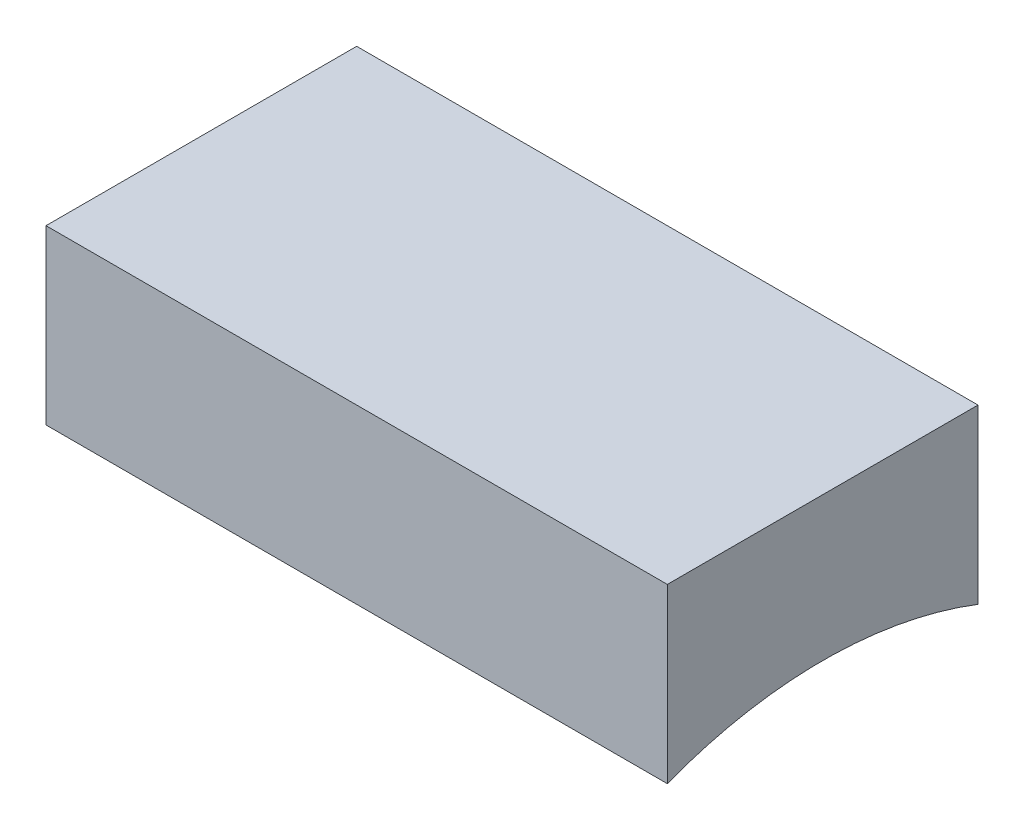
ISO-10303-21;
HEADER;
FILE_DESCRIPTION(('STEP AP214'),'2;1');
FILE_NAME('part.step','',(''),(''),'','','');
FILE_SCHEMA(('AUTOMOTIVE_DESIGN { 1 0 10303 214 1 1 1 1 }'));
ENDSEC;
DATA;
#1=APPLICATION_CONTEXT('core data for automotive mechanical design processes');
#2=APPLICATION_PROTOCOL_DEFINITION('international standard','automotive_design',2000,#1);
#3=PRODUCT_CONTEXT('',#1,'mechanical');
#4=PRODUCT('Part','Part','',(#3));
#5=PRODUCT_RELATED_PRODUCT_CATEGORY('part','',(#4));
#6=PRODUCT_DEFINITION_FORMATION('','',#4);
#7=PRODUCT_DEFINITION_CONTEXT('part definition',#1,'design');
#8=PRODUCT_DEFINITION('design','',#6,#7);
#9=PRODUCT_DEFINITION_SHAPE('','',#8);
#10=(LENGTH_UNIT() NAMED_UNIT(*) SI_UNIT(.MILLI.,.METRE.));
#11=(NAMED_UNIT(*) PLANE_ANGLE_UNIT() SI_UNIT($,.RADIAN.));
#12=(NAMED_UNIT(*) SI_UNIT($,.STERADIAN.) SOLID_ANGLE_UNIT());
#13=UNCERTAINTY_MEASURE_WITH_UNIT(LENGTH_MEASURE(1.E-05),#10,'distance_accuracy_value','');
#14=(GEOMETRIC_REPRESENTATION_CONTEXT(3) GLOBAL_UNCERTAINTY_ASSIGNED_CONTEXT((#13)) GLOBAL_UNIT_ASSIGNED_CONTEXT((#10,
#11,#12)) REPRESENTATION_CONTEXT('',''));
#15=CARTESIAN_POINT('',(0.,0.,0.));
#16=DIRECTION('',(0.,0.,1.));
#17=DIRECTION('',(1.,0.,0.));
#18=AXIS2_PLACEMENT_3D('',#15,#16,#17);
#19=CARTESIAN_POINT('',(-9.,5.,4.5));
#20=DIRECTION('',(1.,0.,0.));
#21=DIRECTION('',(0.,0.,-1.));
#22=AXIS2_PLACEMENT_3D('',#19,#20,#21);
#23=PLANE('',#22);
#24=DIRECTION('',(0.,-1.,0.));
#25=VECTOR('',#24,1.);
#26=CARTESIAN_POINT('',(-9.,3.6,2.5));
#27=LINE('',#26,#25);
#28=CARTESIAN_POINT('',(-9.,3.6,2.5));
#29=VERTEX_POINT('',#28);
#30=CARTESIAN_POINT('',(-9.,0.58554492422529,2.5));
#31=VERTEX_POINT('',#30);
#32=EDGE_CURVE('E189',#29,#31,#27,.T.);
#33=ORIENTED_EDGE('',*,*,#32,.T.);
#34=CARTESIAN_POINT('',(-9.,-11.6619037896906,0.));
#35=DIRECTION('',(-1.,0.,0.));
#36=DIRECTION('',(0.,0.,-1.));
#37=AXIS2_PLACEMENT_3D('',#34,#35,#36);
#38=CIRCLE('',#37,12.5);
#39=CARTESIAN_POINT('',(-9.,0.,4.5));
#40=VERTEX_POINT('',#39);
#41=EDGE_CURVE('E183',#40,#31,#38,.T.);
#42=ORIENTED_EDGE('',*,*,#41,.F.);
#43=DIRECTION('',(0.,-1.,0.));
#44=VECTOR('',#43,1.);
#45=CARTESIAN_POINT('',(-9.,5.,4.5));
#46=LINE('',#45,#44);
#47=CARTESIAN_POINT('',(-9.,5.,4.5));
#48=VERTEX_POINT('',#47);
#49=EDGE_CURVE('E104',#48,#40,#46,.T.);
#50=ORIENTED_EDGE('',*,*,#49,.F.);
#51=DIRECTION('',(0.,0.,1.));
#52=VECTOR('',#51,1.);
#53=CARTESIAN_POINT('',(-9.,5.,4.5));
#54=LINE('',#53,#52);
#55=CARTESIAN_POINT('',(-9.,5.,-4.5));
#56=VERTEX_POINT('',#55);
#57=EDGE_CURVE('E90',#56,#48,#54,.T.);
#58=ORIENTED_EDGE('',*,*,#57,.F.);
#59=DIRECTION('',(0.,-1.,0.));
#60=VECTOR('',#59,1.);
#61=CARTESIAN_POINT('',(-9.,5.,-4.5));
#62=LINE('',#61,#60);
#63=CARTESIAN_POINT('',(-9.,0.,-4.5));
#64=VERTEX_POINT('',#63);
#65=EDGE_CURVE('E99',#56,#64,#62,.T.);
#66=ORIENTED_EDGE('',*,*,#65,.T.);
#67=CARTESIAN_POINT('',(-9.,0.58554492422529,-2.5));
#68=VERTEX_POINT('',#67);
#69=EDGE_CURVE('E69',#68,#64,#38,.T.);
#70=ORIENTED_EDGE('',*,*,#69,.F.);
#71=DIRECTION('',(0.,-1.,0.));
#72=VECTOR('',#71,1.);
#73=CARTESIAN_POINT('',(-9.,3.6,-2.5));
#74=LINE('',#73,#72);
#75=CARTESIAN_POINT('',(-9.,3.6,-2.5));
#76=VERTEX_POINT('',#75);
#77=EDGE_CURVE('E48',#76,#68,#74,.T.);
#78=ORIENTED_EDGE('',*,*,#77,.F.);
#79=DIRECTION('',(0.,0.,1.));
#80=VECTOR('',#79,1.);
#81=CARTESIAN_POINT('',(-9.,3.6,-2.5));
#82=LINE('',#81,#80);
#83=EDGE_CURVE('E192',#76,#29,#82,.T.);
#84=ORIENTED_EDGE('',*,*,#83,.T.);
#85=EDGE_LOOP('',(#33,#42,#50,#58,#66,#70,#78,#84));
#86=FACE_BOUND('',#85,.T.);
#87=ADVANCED_FACE('F33',(#86),#23,.F.);
#88=CARTESIAN_POINT('',(9.,-11.6619037896906,0.));
#89=DIRECTION('',(-1.,0.,0.));
#90=DIRECTION('',(0.,0.,1.));
#91=AXIS2_PLACEMENT_3D('',#88,#89,#90);
#92=CYLINDRICAL_SURFACE('',#91,12.5);
#93=DIRECTION('',(-1.,0.,0.));
#94=VECTOR('',#93,1.);
#95=CARTESIAN_POINT('',(9.,0.58554492422529,2.5));
#96=LINE('',#95,#94);
#97=CARTESIAN_POINT('',(5.4,0.585544924225289,2.5));
#98=VERTEX_POINT('',#97);
#99=EDGE_CURVE('E11',#98,#31,#96,.T.);
#100=ORIENTED_EDGE('',*,*,#99,.F.);
#101=CARTESIAN_POINT('',(7.,0.805654110716359,0.9));
#102=CARTESIAN_POINT('',(6.99999985959667,0.802394784534018,0.945170151058865));
#103=CARTESIAN_POINT('',(6.99808603655796,0.798888537790257,0.990299871883101));
#104=CARTESIAN_POINT('',(6.99046112322638,0.791417444338855,1.08019413808191));
#105=CARTESIAN_POINT('',(6.98475045583305,0.787452648745855,1.1249587235639));
#106=CARTESIAN_POINT('',(6.96199866546493,0.774939153676864,1.25811218045941));
#107=CARTESIAN_POINT('',(6.93933747857087,0.765757761054272,1.34554730529643));
#108=CARTESIAN_POINT('',(6.87972886689265,0.746214905331677,1.51522524638052));
#109=CARTESIAN_POINT('',(6.84277884724533,0.735853228132318,1.59746711637093));
#110=CARTESIAN_POINT('',(6.75565385362339,0.714598897833527,1.75455556994002));
#111=CARTESIAN_POINT('',(6.70547869310982,0.703706237246408,1.82940204918717));
#112=CARTESIAN_POINT('',(6.59286526217099,0.682064741019977,1.97016739101782));
#113=CARTESIAN_POINT('',(6.53033928322142,0.671317558472885,2.03601634396535));
#114=CARTESIAN_POINT('',(6.3949523474623,0.650859469985577,2.15629122070428));
#115=CARTESIAN_POINT('',(6.32208972895832,0.641148731102351,2.21071530436487));
#116=CARTESIAN_POINT('',(6.16820940374735,0.623565019931765,2.30643188787346));
#117=CARTESIAN_POINT('',(6.08720875612795,0.615688313599212,2.3477511321171));
#118=CARTESIAN_POINT('',(5.91923171108847,0.602418887923724,2.41611482647644));
#119=CARTESIAN_POINT('',(5.83226012222345,0.597024196101398,2.44317061439278));
#120=CARTESIAN_POINT('',(5.68723716392164,0.590614407218349,2.47506690361218));
#121=CARTESIAN_POINT('',(5.63017494234265,0.588720008768401,2.48440845097697));
#122=CARTESIAN_POINT('',(5.51541769344701,0.586182850740518,2.4968752088144));
#123=CARTESIAN_POINT('',(5.45772350677789,0.585538593364218,2.50000785828572));
#124=CARTESIAN_POINT('',(5.4,0.585544924225291,2.5));
#125=B_SPLINE_CURVE_WITH_KNOTS('',3,(#101,#102,#103,#104,#105,#106,#107,#108,#109,#110,#111,
#112,#113,#114,#115,#116,#117,#118,#119,#120,#121,#122,#123,#124),.UNSPECIFIED.,.F.,.F.,(4,2,2,
2,2,2,2,2,2,2,2,4),(0.,0.13577739714354,0.271539673682466,0.542510298152163,0.81353015422453,
1.08455383320238,1.35757624471063,1.63064259651492,1.90314803336852,2.17543653201661,
2.34866967936891,2.52169514702194),.UNSPECIFIED.);
#126=CARTESIAN_POINT('',(7.,0.805654110716361,0.9));
#127=VERTEX_POINT('',#126);
#128=EDGE_CURVE('E41',#127,#98,#125,.T.);
#129=ORIENTED_EDGE('',*,*,#128,.F.);
#130=CARTESIAN_POINT('',(7.,-11.6619037896906,0.));
#131=DIRECTION('',(-1.,0.,0.));
#132=DIRECTION('',(0.,0.,1.));
#133=AXIS2_PLACEMENT_3D('',#130,#131,#132);
#134=CIRCLE('',#133,12.5);
#135=CARTESIAN_POINT('',(7.,0.805654110716359,-0.9));
#136=VERTEX_POINT('',#135);
#137=EDGE_CURVE('E131',#136,#127,#134,.F.);
#138=ORIENTED_EDGE('',*,*,#137,.F.);
#139=CARTESIAN_POINT('',(5.4,0.585544924225289,-2.5));
#140=CARTESIAN_POINT('',(5.44447478528946,0.585543455331564,-2.50000021689725));
#141=CARTESIAN_POINT('',(5.48892788903661,0.58592384545061,-2.49814443299796));
#142=CARTESIAN_POINT('',(5.57750830582583,0.587431443239871,-2.49074436307279));
#143=CARTESIAN_POINT('',(5.62163565461922,0.588558567686464,-2.48520048808476));
#144=CARTESIAN_POINT('',(5.75291094884181,0.593027695955822,-2.46310659922895));
#145=CARTESIAN_POINT('',(5.83916733116342,0.597457617127609,-2.44109405805094));
#146=CARTESIAN_POINT('',(6.00666605489368,0.608846533275155,-2.38317982723374));
#147=CARTESIAN_POINT('',(6.08790750041616,0.615805978613322,-2.3472756642242));
#148=CARTESIAN_POINT('',(6.24321474045728,0.631682992463709,-2.26264687616855));
#149=CARTESIAN_POINT('',(6.31727999251689,0.640600708838345,-2.21392128296454));
#150=CARTESIAN_POINT('',(6.45707089969971,0.659809581332696,-2.1043995153733));
#151=CARTESIAN_POINT('',(6.52269016959588,0.670115432216295,-2.04347022730598));
#152=CARTESIAN_POINT('',(6.64284955066309,0.691246904005578,-1.9115754408924));
#153=CARTESIAN_POINT('',(6.69738698402516,0.702072649758913,-1.84060752382735));
#154=CARTESIAN_POINT('',(6.79459931500864,0.723634220162914,-1.68948249299581));
#155=CARTESIAN_POINT('',(6.83709240546734,0.734366514753759,-1.60920794216262));
#156=CARTESIAN_POINT('',(6.90792121314798,0.754862422575954,-1.44254874295049));
#157=CARTESIAN_POINT('',(6.93626571151313,0.764626633612568,-1.35616792245351));
#158=CARTESIAN_POINT('',(6.97133736280917,0.77975695139372,-1.20778503668604));
#159=CARTESIAN_POINT('',(6.98206968951826,0.785535674197743,-1.14674178877397));
#160=CARTESIAN_POINT('',(6.99640223864335,0.796251711006129,-1.02382020525282));
#161=CARTESIAN_POINT('',(7.00001027927942,0.801189941923151,-0.961942860178801));
#162=CARTESIAN_POINT('',(7.,0.80565411071636,-0.9));
#163=B_SPLINE_CURVE_WITH_KNOTS('',3,(#139,#140,#141,#142,#143,#144,#145,#146,#147,#148,#149,
#150,#151,#152,#153,#154,#155,#156,#157,#158,#159,#160,#161,#162),.UNSPECIFIED.,.F.,.F.,(4,2,2,
2,2,2,2,2,2,2,2,4),(0.,0.133341175762014,0.266667493134828,0.532682892684959,0.798745677458551,
1.06482855864422,1.33398952523074,1.6032154545847,1.87631177853693,2.14923839734213,
2.33558838916868,2.52173376586004),.UNSPECIFIED.);
#164=CARTESIAN_POINT('',(5.4,0.585544924225292,-2.5));
#165=VERTEX_POINT('',#164);
#166=EDGE_CURVE('E123',#165,#136,#163,.T.);
#167=ORIENTED_EDGE('',*,*,#166,.F.);
#168=DIRECTION('',(-1.,0.,0.));
#169=VECTOR('',#168,1.);
#170=CARTESIAN_POINT('',(9.,0.585544924225292,-2.5));
#171=LINE('',#170,#169);
#172=EDGE_CURVE('E121',#68,#165,#171,.F.);
#173=ORIENTED_EDGE('',*,*,#172,.F.);
#174=ORIENTED_EDGE('',*,*,#69,.T.);
#175=DIRECTION('',(-1.,0.,0.));
#176=VECTOR('',#175,1.);
#177=CARTESIAN_POINT('',(-9.,0.,-4.5));
#178=LINE('',#177,#176);
#179=CARTESIAN_POINT('',(9.,0.,-4.5));
#180=VERTEX_POINT('',#179);
#181=EDGE_CURVE('E101',#180,#64,#178,.T.);
#182=ORIENTED_EDGE('',*,*,#181,.F.);
#183=CARTESIAN_POINT('',(9.,-11.6619037896906,0.));
#184=DIRECTION('',(-1.,0.,0.));
#185=DIRECTION('',(0.,0.,-1.));
#186=AXIS2_PLACEMENT_3D('',#183,#184,#185);
#187=CIRCLE('',#186,12.5);
#188=CARTESIAN_POINT('',(9.,0.,4.5));
#189=VERTEX_POINT('',#188);
#190=EDGE_CURVE('E78',#189,#180,#187,.T.);
#191=ORIENTED_EDGE('',*,*,#190,.F.);
#192=DIRECTION('',(1.,0.,0.));
#193=VECTOR('',#192,1.);
#194=CARTESIAN_POINT('',(-9.,0.,4.5));
#195=LINE('',#194,#193);
#196=EDGE_CURVE('E115',#40,#189,#195,.T.);
#197=ORIENTED_EDGE('',*,*,#196,.F.);
#198=ORIENTED_EDGE('',*,*,#41,.T.);
#199=EDGE_LOOP('',(#100,#129,#138,#167,#173,#174,#182,#191,#197,#198));
#200=FACE_BOUND('',#199,.T.);
#201=ADVANCED_FACE('F132',(#200),#92,.F.);
#202=CARTESIAN_POINT('',(9.,5.,4.5));
#203=DIRECTION('',(-1.,0.,0.));
#204=DIRECTION('',(0.,0.,1.));
#205=AXIS2_PLACEMENT_3D('',#202,#203,#204);
#206=PLANE('',#205);
#207=DIRECTION('',(0.,-1.,0.));
#208=VECTOR('',#207,1.);
#209=CARTESIAN_POINT('',(9.,5.,4.5));
#210=LINE('',#209,#208);
#211=CARTESIAN_POINT('',(9.,5.,4.5));
#212=VERTEX_POINT('',#211);
#213=EDGE_CURVE('E110',#212,#189,#210,.T.);
#214=ORIENTED_EDGE('',*,*,#213,.T.);
#215=ORIENTED_EDGE('',*,*,#190,.T.);
#216=DIRECTION('',(0.,-1.,0.));
#217=VECTOR('',#216,1.);
#218=CARTESIAN_POINT('',(9.,5.,-4.5));
#219=LINE('',#218,#217);
#220=CARTESIAN_POINT('',(9.,5.,-4.5));
#221=VERTEX_POINT('',#220);
#222=EDGE_CURVE('E103',#221,#180,#219,.T.);
#223=ORIENTED_EDGE('',*,*,#222,.F.);
#224=DIRECTION('',(0.,0.,-1.));
#225=VECTOR('',#224,1.);
#226=CARTESIAN_POINT('',(9.,5.,4.5));
#227=LINE('',#226,#225);
#228=EDGE_CURVE('E93',#212,#221,#227,.T.);
#229=ORIENTED_EDGE('',*,*,#228,.F.);
#230=EDGE_LOOP('',(#214,#215,#223,#229));
#231=FACE_BOUND('',#230,.T.);
#232=ADVANCED_FACE('F35',(#231),#206,.F.);
#233=CARTESIAN_POINT('',(-9.,5.,-4.5));
#234=DIRECTION('',(0.,0.,1.));
#235=DIRECTION('',(1.,0.,0.));
#236=AXIS2_PLACEMENT_3D('',#233,#234,#235);
#237=PLANE('',#236);
#238=ORIENTED_EDGE('',*,*,#181,.T.);
#239=ORIENTED_EDGE('',*,*,#65,.F.);
#240=DIRECTION('',(-1.,0.,0.));
#241=VECTOR('',#240,1.);
#242=CARTESIAN_POINT('',(-9.,5.,-4.5));
#243=LINE('',#242,#241);
#244=EDGE_CURVE('E86',#221,#56,#243,.T.);
#245=ORIENTED_EDGE('',*,*,#244,.F.);
#246=ORIENTED_EDGE('',*,*,#222,.T.);
#247=EDGE_LOOP('',(#238,#239,#245,#246));
#248=FACE_BOUND('',#247,.T.);
#249=ADVANCED_FACE('F100',(#248),#237,.F.);
#250=CARTESIAN_POINT('',(-9.,5.,4.5));
#251=DIRECTION('',(0.,0.,-1.));
#252=DIRECTION('',(-1.,0.,0.));
#253=AXIS2_PLACEMENT_3D('',#250,#251,#252);
#254=PLANE('',#253);
#255=ORIENTED_EDGE('',*,*,#196,.T.);
#256=ORIENTED_EDGE('',*,*,#213,.F.);
#257=DIRECTION('',(1.,0.,0.));
#258=VECTOR('',#257,1.);
#259=CARTESIAN_POINT('',(-9.,5.,4.5));
#260=LINE('',#259,#258);
#261=EDGE_CURVE('E57',#48,#212,#260,.T.);
#262=ORIENTED_EDGE('',*,*,#261,.F.);
#263=ORIENTED_EDGE('',*,*,#49,.T.);
#264=EDGE_LOOP('',(#255,#256,#262,#263));
#265=FACE_BOUND('',#264,.T.);
#266=ADVANCED_FACE('F199',(#265),#254,.F.);
#267=CARTESIAN_POINT('',(0.,5.,0.));
#268=DIRECTION('',(0.,-1.,0.));
#269=DIRECTION('',(0.,0.,-1.));
#270=AXIS2_PLACEMENT_3D('',#267,#268,#269);
#271=PLANE('',#270);
#272=ORIENTED_EDGE('',*,*,#228,.T.);
#273=ORIENTED_EDGE('',*,*,#244,.T.);
#274=ORIENTED_EDGE('',*,*,#57,.T.);
#275=ORIENTED_EDGE('',*,*,#261,.T.);
#276=EDGE_LOOP('',(#272,#273,#274,#275));
#277=FACE_BOUND('',#276,.T.);
#278=ADVANCED_FACE('F88',(#277),#271,.F.);
#279=CARTESIAN_POINT('',(-9.,3.6,2.5));
#280=DIRECTION('',(0.,0.,-1.));
#281=DIRECTION('',(-1.,0.,0.));
#282=AXIS2_PLACEMENT_3D('',#279,#280,#281);
#283=PLANE('',#282);
#284=ORIENTED_EDGE('',*,*,#99,.T.);
#285=ORIENTED_EDGE('',*,*,#32,.F.);
#286=DIRECTION('',(1.,0.,0.));
#287=VECTOR('',#286,1.);
#288=CARTESIAN_POINT('',(-9.,3.6,2.5));
#289=LINE('',#288,#287);
#290=CARTESIAN_POINT('',(5.4,3.6,2.5));
#291=VERTEX_POINT('',#290);
#292=EDGE_CURVE('E285',#29,#291,#289,.T.);
#293=ORIENTED_EDGE('',*,*,#292,.T.);
#294=DIRECTION('',(0.,-1.,0.));
#295=VECTOR('',#294,1.);
#296=CARTESIAN_POINT('',(5.4,3.6,2.5));
#297=LINE('',#296,#295);
#298=EDGE_CURVE('E179',#291,#98,#297,.T.);
#299=ORIENTED_EDGE('',*,*,#298,.T.);
#300=EDGE_LOOP('',(#284,#285,#293,#299));
#301=FACE_BOUND('',#300,.T.);
#302=ADVANCED_FACE('F151',(#301),#283,.T.);
#303=CARTESIAN_POINT('',(5.4,3.6,0.9));
#304=DIRECTION('',(0.,-1.,0.));
#305=DIRECTION('',(0.,0.,-1.));
#306=AXIS2_PLACEMENT_3D('',#303,#304,#305);
#307=CYLINDRICAL_SURFACE('',#306,1.6);
#308=ORIENTED_EDGE('',*,*,#128,.T.);
#309=ORIENTED_EDGE('',*,*,#298,.F.);
#310=CARTESIAN_POINT('',(5.4,3.6,0.9));
#311=DIRECTION('',(0.,1.,0.));
#312=DIRECTION('',(0.,0.,1.));
#313=AXIS2_PLACEMENT_3D('',#310,#311,#312);
#314=CIRCLE('',#313,1.6);
#315=CARTESIAN_POINT('',(7.,3.6,0.9));
#316=VERTEX_POINT('',#315);
#317=EDGE_CURVE('E178',#291,#316,#314,.T.);
#318=ORIENTED_EDGE('',*,*,#317,.T.);
#319=DIRECTION('',(0.,-1.,0.));
#320=VECTOR('',#319,1.);
#321=CARTESIAN_POINT('',(7.,3.6,0.9));
#322=LINE('',#321,#320);
#323=EDGE_CURVE('E169',#316,#127,#322,.T.);
#324=ORIENTED_EDGE('',*,*,#323,.T.);
#325=EDGE_LOOP('',(#308,#309,#318,#324));
#326=FACE_BOUND('',#325,.T.);
#327=ADVANCED_FACE('F147',(#326),#307,.F.);
#328=CARTESIAN_POINT('',(7.,3.6,-0.9));
#329=DIRECTION('',(-1.,0.,0.));
#330=DIRECTION('',(0.,0.,1.));
#331=AXIS2_PLACEMENT_3D('',#328,#329,#330);
#332=PLANE('',#331);
#333=ORIENTED_EDGE('',*,*,#137,.T.);
#334=ORIENTED_EDGE('',*,*,#323,.F.);
#335=DIRECTION('',(0.,0.,-1.));
#336=VECTOR('',#335,1.);
#337=CARTESIAN_POINT('',(7.,3.6,-0.9));
#338=LINE('',#337,#336);
#339=CARTESIAN_POINT('',(7.,3.6,-0.9));
#340=VERTEX_POINT('',#339);
#341=EDGE_CURVE('E299',#316,#340,#338,.T.);
#342=ORIENTED_EDGE('',*,*,#341,.T.);
#343=DIRECTION('',(0.,-1.,0.));
#344=VECTOR('',#343,1.);
#345=CARTESIAN_POINT('',(7.,3.6,-0.9));
#346=LINE('',#345,#344);
#347=EDGE_CURVE('E173',#340,#136,#346,.T.);
#348=ORIENTED_EDGE('',*,*,#347,.T.);
#349=EDGE_LOOP('',(#333,#334,#342,#348));
#350=FACE_BOUND('',#349,.T.);
#351=ADVANCED_FACE('F142',(#350),#332,.T.);
#352=CARTESIAN_POINT('',(5.4,3.6,-0.9));
#353=DIRECTION('',(0.,-1.,0.));
#354=DIRECTION('',(0.,0.,-1.));
#355=AXIS2_PLACEMENT_3D('',#352,#353,#354);
#356=CYLINDRICAL_SURFACE('',#355,1.6);
#357=ORIENTED_EDGE('',*,*,#166,.T.);
#358=ORIENTED_EDGE('',*,*,#347,.F.);
#359=CARTESIAN_POINT('',(5.4,3.6,-0.9));
#360=DIRECTION('',(0.,1.,0.));
#361=DIRECTION('',(0.,0.,-1.));
#362=AXIS2_PLACEMENT_3D('',#359,#360,#361);
#363=CIRCLE('',#362,1.6);
#364=CARTESIAN_POINT('',(5.4,3.6,-2.5));
#365=VERTEX_POINT('',#364);
#366=EDGE_CURVE('E293',#340,#365,#363,.T.);
#367=ORIENTED_EDGE('',*,*,#366,.T.);
#368=DIRECTION('',(0.,-1.,0.));
#369=VECTOR('',#368,1.);
#370=CARTESIAN_POINT('',(5.4,3.6,-2.5));
#371=LINE('',#370,#369);
#372=EDGE_CURVE('E289',#365,#165,#371,.T.);
#373=ORIENTED_EDGE('',*,*,#372,.T.);
#374=EDGE_LOOP('',(#357,#358,#367,#373));
#375=FACE_BOUND('',#374,.T.);
#376=ADVANCED_FACE('F136',(#375),#356,.F.);
#377=CARTESIAN_POINT('',(-9.,3.6,-2.5));
#378=DIRECTION('',(0.,0.,1.));
#379=DIRECTION('',(1.,0.,0.));
#380=AXIS2_PLACEMENT_3D('',#377,#378,#379);
#381=PLANE('',#380);
#382=ORIENTED_EDGE('',*,*,#172,.T.);
#383=ORIENTED_EDGE('',*,*,#372,.F.);
#384=DIRECTION('',(-1.,0.,0.));
#385=VECTOR('',#384,1.);
#386=CARTESIAN_POINT('',(-9.,3.6,-2.5));
#387=LINE('',#386,#385);
#388=EDGE_CURVE('E284',#365,#76,#387,.T.);
#389=ORIENTED_EDGE('',*,*,#388,.T.);
#390=ORIENTED_EDGE('',*,*,#77,.T.);
#391=EDGE_LOOP('',(#382,#383,#389,#390));
#392=FACE_BOUND('',#391,.T.);
#393=ADVANCED_FACE('F141',(#392),#381,.T.);
#394=CARTESIAN_POINT('',(5.4,3.6,0.9));
#395=DIRECTION('',(0.,1.,0.));
#396=DIRECTION('',(0.,0.,1.));
#397=AXIS2_PLACEMENT_3D('',#394,#395,#396);
#398=PLANE('',#397);
#399=ORIENTED_EDGE('',*,*,#83,.F.);
#400=ORIENTED_EDGE('',*,*,#388,.F.);
#401=ORIENTED_EDGE('',*,*,#366,.F.);
#402=ORIENTED_EDGE('',*,*,#341,.F.);
#403=ORIENTED_EDGE('',*,*,#317,.F.);
#404=ORIENTED_EDGE('',*,*,#292,.F.);
#405=EDGE_LOOP('',(#399,#400,#401,#402,#403,#404));
#406=FACE_BOUND('',#405,.T.);
#407=ADVANCED_FACE('F268',(#406),#398,.F.);
#408=CLOSED_SHELL('',(#87,#201,#232,#249,#266,#278,#302,#327,#351,#376,#393,#407));
#409=MANIFOLD_SOLID_BREP('B2',#408);
#410=ADVANCED_BREP_SHAPE_REPRESENTATION('',(#18,#409),#14);
#411=SHAPE_DEFINITION_REPRESENTATION(#9,#410);
ENDSEC;
END-ISO-10303-21;
